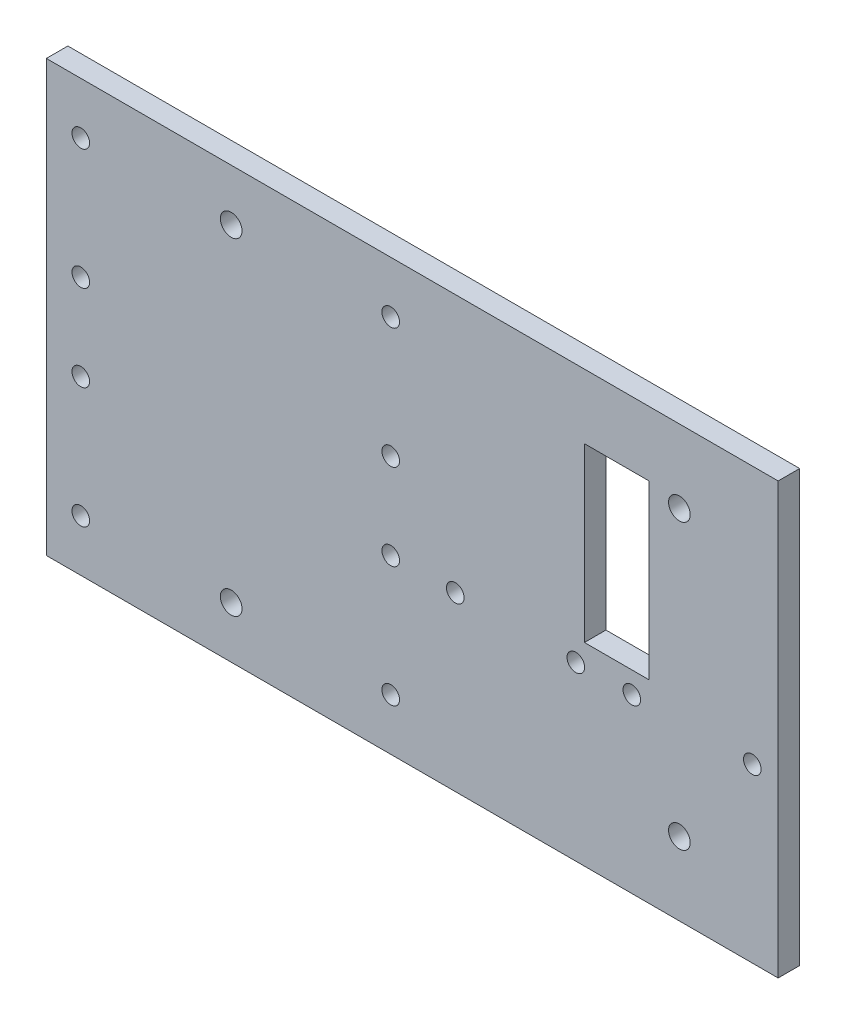
ISO-10303-21;
HEADER;
FILE_DESCRIPTION(('STEP AP214'),'2;1');
FILE_NAME('part.step','',(''),(''),'','','');
FILE_SCHEMA(('AUTOMOTIVE_DESIGN { 1 0 10303 214 1 1 1 1 }'));
ENDSEC;
DATA;
#1=APPLICATION_CONTEXT('core data for automotive mechanical design processes');
#2=APPLICATION_PROTOCOL_DEFINITION('international standard','automotive_design',2000,#1);
#3=PRODUCT_CONTEXT('',#1,'mechanical');
#4=PRODUCT('Part','Part','',(#3));
#5=PRODUCT_RELATED_PRODUCT_CATEGORY('part','',(#4));
#6=PRODUCT_DEFINITION_FORMATION('','',#4);
#7=PRODUCT_DEFINITION_CONTEXT('part definition',#1,'design');
#8=PRODUCT_DEFINITION('design','',#6,#7);
#9=PRODUCT_DEFINITION_SHAPE('','',#8);
#10=(LENGTH_UNIT() NAMED_UNIT(*) SI_UNIT(.MILLI.,.METRE.));
#11=(NAMED_UNIT(*) PLANE_ANGLE_UNIT() SI_UNIT($,.RADIAN.));
#12=(NAMED_UNIT(*) SI_UNIT($,.STERADIAN.) SOLID_ANGLE_UNIT());
#13=UNCERTAINTY_MEASURE_WITH_UNIT(LENGTH_MEASURE(1.E-05),#10,'distance_accuracy_value','');
#14=(GEOMETRIC_REPRESENTATION_CONTEXT(3) GLOBAL_UNCERTAINTY_ASSIGNED_CONTEXT((#13)) GLOBAL_UNIT_ASSIGNED_CONTEXT((#10,
#11,#12)) REPRESENTATION_CONTEXT('',''));
#15=CARTESIAN_POINT('',(0.,0.,0.));
#16=DIRECTION('',(0.,0.,1.));
#17=DIRECTION('',(1.,0.,0.));
#18=AXIS2_PLACEMENT_3D('',#15,#16,#17);
#19=CARTESIAN_POINT('',(47.625,31.75,3.175));
#20=DIRECTION('',(-1.,0.,0.));
#21=DIRECTION('',(0.,0.,1.));
#22=AXIS2_PLACEMENT_3D('',#19,#20,#21);
#23=PLANE('',#22);
#24=DIRECTION('',(0.,1.,0.));
#25=VECTOR('',#24,1.);
#26=CARTESIAN_POINT('',(47.625,31.75,0.));
#27=LINE('',#26,#25);
#28=CARTESIAN_POINT('',(47.625,-31.75,0.));
#29=VERTEX_POINT('',#28);
#30=CARTESIAN_POINT('',(47.625,31.75,0.));
#31=VERTEX_POINT('',#30);
#32=EDGE_CURVE('E111',#29,#31,#27,.T.);
#33=ORIENTED_EDGE('',*,*,#32,.T.);
#34=DIRECTION('',(0.,0.,-1.));
#35=VECTOR('',#34,1.);
#36=CARTESIAN_POINT('',(47.625,31.75,3.175));
#37=LINE('',#36,#35);
#38=CARTESIAN_POINT('',(47.625,31.75,3.175));
#39=VERTEX_POINT('',#38);
#40=EDGE_CURVE('E11',#39,#31,#37,.T.);
#41=ORIENTED_EDGE('',*,*,#40,.F.);
#42=DIRECTION('',(0.,1.,0.));
#43=VECTOR('',#42,1.);
#44=CARTESIAN_POINT('',(47.625,31.75,3.175));
#45=LINE('',#44,#43);
#46=CARTESIAN_POINT('',(47.625,-31.75,3.175));
#47=VERTEX_POINT('',#46);
#48=EDGE_CURVE('E183',#47,#39,#45,.T.);
#49=ORIENTED_EDGE('',*,*,#48,.F.);
#50=DIRECTION('',(0.,0.,-1.));
#51=VECTOR('',#50,1.);
#52=CARTESIAN_POINT('',(47.625,-31.75,3.175));
#53=LINE('',#52,#51);
#54=EDGE_CURVE('E43',#47,#29,#53,.T.);
#55=ORIENTED_EDGE('',*,*,#54,.T.);
#56=EDGE_LOOP('',(#33,#41,#49,#55));
#57=FACE_BOUND('',#56,.T.);
#58=ADVANCED_FACE('F36',(#57),#23,.F.);
#59=CARTESIAN_POINT('',(-47.625,31.75,3.175));
#60=DIRECTION('',(0.,-1.,0.));
#61=DIRECTION('',(0.,0.,-1.));
#62=AXIS2_PLACEMENT_3D('',#59,#60,#61);
#63=PLANE('',#62);
#64=DIRECTION('',(-1.,0.,0.));
#65=VECTOR('',#64,1.);
#66=CARTESIAN_POINT('',(-47.625,31.75,0.));
#67=LINE('',#66,#65);
#68=CARTESIAN_POINT('',(-60.325,31.75,0.));
#69=VERTEX_POINT('',#68);
#70=EDGE_CURVE('E100',#31,#69,#67,.T.);
#71=ORIENTED_EDGE('',*,*,#70,.T.);
#72=DIRECTION('',(0.,0.,1.));
#73=VECTOR('',#72,1.);
#74=CARTESIAN_POINT('',(-60.325,31.75,0.));
#75=LINE('',#74,#73);
#76=CARTESIAN_POINT('',(-60.325,31.75,3.175));
#77=VERTEX_POINT('',#76);
#78=EDGE_CURVE('E103',#69,#77,#75,.T.);
#79=ORIENTED_EDGE('',*,*,#78,.T.);
#80=DIRECTION('',(-1.,0.,0.));
#81=VECTOR('',#80,1.);
#82=CARTESIAN_POINT('',(-47.625,31.75,3.175));
#83=LINE('',#82,#81);
#84=EDGE_CURVE('E186',#39,#77,#83,.T.);
#85=ORIENTED_EDGE('',*,*,#84,.F.);
#86=ORIENTED_EDGE('',*,*,#40,.T.);
#87=EDGE_LOOP('',(#71,#79,#85,#86));
#88=FACE_BOUND('',#87,.T.);
#89=ADVANCED_FACE('F102',(#88),#63,.F.);
#90=CARTESIAN_POINT('',(-47.625,-31.75,3.175));
#91=DIRECTION('',(0.,1.,0.));
#92=DIRECTION('',(0.,0.,1.));
#93=AXIS2_PLACEMENT_3D('',#90,#91,#92);
#94=PLANE('',#93);
#95=DIRECTION('',(1.,0.,0.));
#96=VECTOR('',#95,1.);
#97=CARTESIAN_POINT('',(-47.625,-31.75,0.));
#98=LINE('',#97,#96);
#99=CARTESIAN_POINT('',(-60.325,-31.75,0.));
#100=VERTEX_POINT('',#99);
#101=EDGE_CURVE('E110',#100,#29,#98,.T.);
#102=ORIENTED_EDGE('',*,*,#101,.T.);
#103=ORIENTED_EDGE('',*,*,#54,.F.);
#104=DIRECTION('',(1.,0.,0.));
#105=VECTOR('',#104,1.);
#106=CARTESIAN_POINT('',(-47.625,-31.75,3.175));
#107=LINE('',#106,#105);
#108=CARTESIAN_POINT('',(-60.325,-31.75,3.175));
#109=VERTEX_POINT('',#108);
#110=EDGE_CURVE('E188',#109,#47,#107,.T.);
#111=ORIENTED_EDGE('',*,*,#110,.F.);
#112=DIRECTION('',(0.,0.,1.));
#113=VECTOR('',#112,1.);
#114=CARTESIAN_POINT('',(-60.325,-31.75,0.));
#115=LINE('',#114,#113);
#116=EDGE_CURVE('E120',#100,#109,#115,.T.);
#117=ORIENTED_EDGE('',*,*,#116,.F.);
#118=EDGE_LOOP('',(#102,#103,#111,#117));
#119=FACE_BOUND('',#118,.T.);
#120=ADVANCED_FACE('F196',(#119),#94,.F.);
#121=CARTESIAN_POINT('',(0.,0.,3.175));
#122=DIRECTION('',(0.,0.,1.));
#123=DIRECTION('',(1.,0.,0.));
#124=AXIS2_PLACEMENT_3D('',#121,#122,#123);
#125=PLANE('',#124);
#126=CARTESIAN_POINT('',(0.,-6.35,3.175));
#127=DIRECTION('',(0.,0.,1.));
#128=DIRECTION('',(1.,0.,0.));
#129=AXIS2_PLACEMENT_3D('',#126,#127,#128);
#130=CIRCLE('',#129,1.29999994);
#131=CARTESIAN_POINT('',(1.29999994,-6.35,3.175));
#132=VERTEX_POINT('',#131);
#133=EDGE_CURVE('E492',#132,#132,#130,.T.);
#134=ORIENTED_EDGE('',*,*,#133,.F.);
#135=EDGE_LOOP('',(#134));
#136=FACE_BOUND('',#135,.T.);
#137=CARTESIAN_POINT('',(26.035,-6.34999999999999,3.175));
#138=DIRECTION('',(0.,0.,1.));
#139=DIRECTION('',(1.,0.,0.));
#140=AXIS2_PLACEMENT_3D('',#137,#138,#139);
#141=CIRCLE('',#140,1.29999994);
#142=CARTESIAN_POINT('',(27.33499994,-6.34999999999999,3.175));
#143=VERTEX_POINT('',#142);
#144=EDGE_CURVE('E505',#143,#143,#141,.T.);
#145=ORIENTED_EDGE('',*,*,#144,.F.);
#146=EDGE_LOOP('',(#145));
#147=FACE_BOUND('',#146,.T.);
#148=CARTESIAN_POINT('',(17.78,-6.35,3.175));
#149=DIRECTION('',(0.,0.,1.));
#150=DIRECTION('',(1.,0.,0.));
#151=AXIS2_PLACEMENT_3D('',#148,#149,#150);
#152=CIRCLE('',#151,1.29999994);
#153=CARTESIAN_POINT('',(19.07999994,-6.35,3.175));
#154=VERTEX_POINT('',#153);
#155=EDGE_CURVE('E504',#154,#154,#152,.T.);
#156=ORIENTED_EDGE('',*,*,#155,.F.);
#157=EDGE_LOOP('',(#156));
#158=FACE_BOUND('',#157,.T.);
#159=CARTESIAN_POINT('',(43.815,-6.34999999999999,3.175));
#160=DIRECTION('',(0.,0.,1.));
#161=DIRECTION('',(1.,0.,0.));
#162=AXIS2_PLACEMENT_3D('',#159,#160,#161);
#163=CIRCLE('',#162,1.29999994);
#164=CARTESIAN_POINT('',(45.11499994,-6.34999999999999,3.175));
#165=VERTEX_POINT('',#164);
#166=EDGE_CURVE('E498',#165,#165,#163,.T.);
#167=ORIENTED_EDGE('',*,*,#166,.F.);
#168=EDGE_LOOP('',(#167));
#169=FACE_BOUND('',#168,.T.);
#170=CARTESIAN_POINT('',(-9.525,24.13,3.175));
#171=DIRECTION('',(0.,0.,1.));
#172=DIRECTION('',(1.,0.,0.));
#173=AXIS2_PLACEMENT_3D('',#170,#171,#172);
#174=CIRCLE('',#173,1.3);
#175=CARTESIAN_POINT('',(-8.225,24.13,3.175));
#176=VERTEX_POINT('',#175);
#177=EDGE_CURVE('E536',#176,#176,#174,.T.);
#178=ORIENTED_EDGE('',*,*,#177,.F.);
#179=EDGE_LOOP('',(#178));
#180=FACE_BOUND('',#179,.T.);
#181=CARTESIAN_POINT('',(-9.525,6.35,3.175));
#182=DIRECTION('',(0.,0.,1.));
#183=DIRECTION('',(1.,0.,0.));
#184=AXIS2_PLACEMENT_3D('',#181,#182,#183);
#185=CIRCLE('',#184,1.3);
#186=CARTESIAN_POINT('',(-8.225,6.35,3.175));
#187=VERTEX_POINT('',#186);
#188=EDGE_CURVE('E542',#187,#187,#185,.T.);
#189=ORIENTED_EDGE('',*,*,#188,.F.);
#190=EDGE_LOOP('',(#189));
#191=FACE_BOUND('',#190,.T.);
#192=CARTESIAN_POINT('',(-55.245,6.35,3.175));
#193=DIRECTION('',(0.,0.,1.));
#194=DIRECTION('',(1.,0.,0.));
#195=AXIS2_PLACEMENT_3D('',#192,#193,#194);
#196=CIRCLE('',#195,1.3);
#197=CARTESIAN_POINT('',(-53.945,6.35,3.175));
#198=VERTEX_POINT('',#197);
#199=EDGE_CURVE('E548',#198,#198,#196,.T.);
#200=ORIENTED_EDGE('',*,*,#199,.F.);
#201=EDGE_LOOP('',(#200));
#202=FACE_BOUND('',#201,.T.);
#203=CARTESIAN_POINT('',(-55.245,-6.35,3.175));
#204=DIRECTION('',(0.,0.,1.));
#205=DIRECTION('',(1.,0.,0.));
#206=AXIS2_PLACEMENT_3D('',#203,#204,#205);
#207=CIRCLE('',#206,1.3);
#208=CARTESIAN_POINT('',(-53.945,-6.35,3.175));
#209=VERTEX_POINT('',#208);
#210=EDGE_CURVE('E518',#209,#209,#207,.T.);
#211=ORIENTED_EDGE('',*,*,#210,.F.);
#212=EDGE_LOOP('',(#211));
#213=FACE_BOUND('',#212,.T.);
#214=CARTESIAN_POINT('',(-9.525,-6.35,3.175));
#215=DIRECTION('',(0.,0.,1.));
#216=DIRECTION('',(1.,0.,0.));
#217=AXIS2_PLACEMENT_3D('',#214,#215,#216);
#218=CIRCLE('',#217,1.3);
#219=CARTESIAN_POINT('',(-8.225,-6.35,3.175));
#220=VERTEX_POINT('',#219);
#221=EDGE_CURVE('E519',#220,#220,#218,.T.);
#222=ORIENTED_EDGE('',*,*,#221,.F.);
#223=EDGE_LOOP('',(#222));
#224=FACE_BOUND('',#223,.T.);
#225=CARTESIAN_POINT('',(-9.525,-24.13,3.175));
#226=DIRECTION('',(0.,0.,1.));
#227=DIRECTION('',(1.,0.,0.));
#228=AXIS2_PLACEMENT_3D('',#225,#226,#227);
#229=CIRCLE('',#228,1.3);
#230=CARTESIAN_POINT('',(-8.225,-24.13,3.175));
#231=VERTEX_POINT('',#230);
#232=EDGE_CURVE('E525',#231,#231,#229,.T.);
#233=ORIENTED_EDGE('',*,*,#232,.F.);
#234=EDGE_LOOP('',(#233));
#235=FACE_BOUND('',#234,.T.);
#236=CARTESIAN_POINT('',(-55.245,-24.13,3.175));
#237=DIRECTION('',(0.,0.,1.));
#238=DIRECTION('',(1.,0.,0.));
#239=AXIS2_PLACEMENT_3D('',#236,#237,#238);
#240=CIRCLE('',#239,1.3);
#241=CARTESIAN_POINT('',(-53.945,-24.13,3.175));
#242=VERTEX_POINT('',#241);
#243=EDGE_CURVE('E495',#242,#242,#240,.T.);
#244=ORIENTED_EDGE('',*,*,#243,.F.);
#245=EDGE_LOOP('',(#244));
#246=FACE_BOUND('',#245,.T.);
#247=CARTESIAN_POINT('',(-55.245,24.13,3.175));
#248=DIRECTION('',(0.,0.,1.));
#249=DIRECTION('',(1.,0.,0.));
#250=AXIS2_PLACEMENT_3D('',#247,#248,#249);
#251=CIRCLE('',#250,1.3);
#252=CARTESIAN_POINT('',(-53.945,24.13,3.175));
#253=VERTEX_POINT('',#252);
#254=EDGE_CURVE('E128',#253,#253,#251,.T.);
#255=ORIENTED_EDGE('',*,*,#254,.F.);
#256=EDGE_LOOP('',(#255));
#257=FACE_BOUND('',#256,.T.);
#258=DIRECTION('',(0.,1.,0.));
#259=VECTOR('',#258,1.);
#260=CARTESIAN_POINT('',(28.575,0.,3.175));
#261=LINE('',#260,#259);
#262=CARTESIAN_POINT('',(28.575,-3.175,3.175));
#263=VERTEX_POINT('',#262);
#264=CARTESIAN_POINT('',(28.575,22.225,3.175));
#265=VERTEX_POINT('',#264);
#266=EDGE_CURVE('E157',#263,#265,#261,.T.);
#267=ORIENTED_EDGE('',*,*,#266,.F.);
#268=DIRECTION('',(1.,0.,0.));
#269=VECTOR('',#268,1.);
#270=CARTESIAN_POINT('',(0.,-3.175,3.175));
#271=LINE('',#270,#269);
#272=CARTESIAN_POINT('',(19.05,-3.175,3.175));
#273=VERTEX_POINT('',#272);
#274=EDGE_CURVE('E155',#273,#263,#271,.T.);
#275=ORIENTED_EDGE('',*,*,#274,.F.);
#276=DIRECTION('',(0.,-1.,0.));
#277=VECTOR('',#276,1.);
#278=CARTESIAN_POINT('',(19.05,0.,3.175));
#279=LINE('',#278,#277);
#280=CARTESIAN_POINT('',(19.05,22.225,3.175));
#281=VERTEX_POINT('',#280);
#282=EDGE_CURVE('E153',#281,#273,#279,.T.);
#283=ORIENTED_EDGE('',*,*,#282,.F.);
#284=DIRECTION('',(-1.,0.,0.));
#285=VECTOR('',#284,1.);
#286=CARTESIAN_POINT('',(0.,22.225,3.175));
#287=LINE('',#286,#285);
#288=EDGE_CURVE('E145',#265,#281,#287,.T.);
#289=ORIENTED_EDGE('',*,*,#288,.F.);
#290=EDGE_LOOP('',(#267,#275,#283,#289));
#291=FACE_BOUND('',#290,.T.);
#292=CARTESIAN_POINT('',(33.0581,-20.955,3.175));
#293=DIRECTION('',(0.,0.,1.));
#294=DIRECTION('',(1.,0.,0.));
#295=AXIS2_PLACEMENT_3D('',#292,#293,#294);
#296=CIRCLE('',#295,1.6);
#297=CARTESIAN_POINT('',(34.6581,-20.955,3.175));
#298=VERTEX_POINT('',#297);
#299=EDGE_CURVE('E170',#298,#298,#296,.T.);
#300=ORIENTED_EDGE('',*,*,#299,.F.);
#301=EDGE_LOOP('',(#300));
#302=FACE_BOUND('',#301,.T.);
#303=CARTESIAN_POINT('',(-33.0581,24.13,3.175));
#304=DIRECTION('',(0.,0.,1.));
#305=DIRECTION('',(1.,0.,0.));
#306=AXIS2_PLACEMENT_3D('',#303,#304,#305);
#307=CIRCLE('',#306,1.6);
#308=CARTESIAN_POINT('',(-31.4581,24.13,3.175));
#309=VERTEX_POINT('',#308);
#310=EDGE_CURVE('E163',#309,#309,#307,.T.);
#311=ORIENTED_EDGE('',*,*,#310,.F.);
#312=EDGE_LOOP('',(#311));
#313=FACE_BOUND('',#312,.T.);
#314=CARTESIAN_POINT('',(-33.0581,-24.13,3.175));
#315=DIRECTION('',(0.,0.,1.));
#316=DIRECTION('',(1.,0.,0.));
#317=AXIS2_PLACEMENT_3D('',#314,#315,#316);
#318=CIRCLE('',#317,1.6);
#319=CARTESIAN_POINT('',(-31.4581,-24.13,3.175));
#320=VERTEX_POINT('',#319);
#321=EDGE_CURVE('E159',#320,#320,#318,.T.);
#322=ORIENTED_EDGE('',*,*,#321,.F.);
#323=EDGE_LOOP('',(#322));
#324=FACE_BOUND('',#323,.T.);
#325=CARTESIAN_POINT('',(33.0581,20.955,3.175));
#326=DIRECTION('',(0.,0.,1.));
#327=DIRECTION('',(1.,0.,0.));
#328=AXIS2_PLACEMENT_3D('',#325,#326,#327);
#329=CIRCLE('',#328,1.6);
#330=CARTESIAN_POINT('',(34.6581,20.955,3.175));
#331=VERTEX_POINT('',#330);
#332=EDGE_CURVE('E169',#331,#331,#329,.T.);
#333=ORIENTED_EDGE('',*,*,#332,.F.);
#334=EDGE_LOOP('',(#333));
#335=FACE_BOUND('',#334,.T.);
#336=ORIENTED_EDGE('',*,*,#48,.T.);
#337=ORIENTED_EDGE('',*,*,#84,.T.);
#338=DIRECTION('',(0.,-1.,0.));
#339=VECTOR('',#338,1.);
#340=CARTESIAN_POINT('',(-60.325,31.75,3.175));
#341=LINE('',#340,#339);
#342=EDGE_CURVE('E119',#77,#109,#341,.T.);
#343=ORIENTED_EDGE('',*,*,#342,.T.);
#344=ORIENTED_EDGE('',*,*,#110,.T.);
#345=EDGE_LOOP('',(#336,#337,#343,#344));
#346=FACE_BOUND('',#345,.T.);
#347=ADVANCED_FACE('F198',(#136,#147,#158,#169,#180,#191,#202,#213,#224,#235,#246,#257,#291,
#302,#313,#324,#335,#346),#125,.T.);
#348=CARTESIAN_POINT('',(0.,0.,0.));
#349=DIRECTION('',(0.,0.,1.));
#350=DIRECTION('',(1.,0.,0.));
#351=AXIS2_PLACEMENT_3D('',#348,#349,#350);
#352=PLANE('',#351);
#353=CARTESIAN_POINT('',(0.,-6.35,0.));
#354=DIRECTION('',(0.,0.,1.));
#355=DIRECTION('',(1.,0.,0.));
#356=AXIS2_PLACEMENT_3D('',#353,#354,#355);
#357=CIRCLE('',#356,1.29999994);
#358=CARTESIAN_POINT('',(1.29999994,-6.35,0.));
#359=VERTEX_POINT('',#358);
#360=EDGE_CURVE('E490',#359,#359,#357,.T.);
#361=ORIENTED_EDGE('',*,*,#360,.T.);
#362=EDGE_LOOP('',(#361));
#363=FACE_BOUND('',#362,.T.);
#364=CARTESIAN_POINT('',(26.035,-6.34999999999999,0.));
#365=DIRECTION('',(0.,0.,1.));
#366=DIRECTION('',(1.,0.,0.));
#367=AXIS2_PLACEMENT_3D('',#364,#365,#366);
#368=CIRCLE('',#367,1.29999994);
#369=CARTESIAN_POINT('',(27.33499994,-6.34999999999999,0.));
#370=VERTEX_POINT('',#369);
#371=EDGE_CURVE('E501',#370,#370,#368,.T.);
#372=ORIENTED_EDGE('',*,*,#371,.T.);
#373=EDGE_LOOP('',(#372));
#374=FACE_BOUND('',#373,.T.);
#375=CARTESIAN_POINT('',(17.78,-6.35,0.));
#376=DIRECTION('',(0.,0.,1.));
#377=DIRECTION('',(1.,0.,0.));
#378=AXIS2_PLACEMENT_3D('',#375,#376,#377);
#379=CIRCLE('',#378,1.29999994);
#380=CARTESIAN_POINT('',(19.07999994,-6.35,0.));
#381=VERTEX_POINT('',#380);
#382=EDGE_CURVE('E510',#381,#381,#379,.T.);
#383=ORIENTED_EDGE('',*,*,#382,.T.);
#384=EDGE_LOOP('',(#383));
#385=FACE_BOUND('',#384,.T.);
#386=CARTESIAN_POINT('',(43.815,-6.34999999999999,0.));
#387=DIRECTION('',(0.,0.,1.));
#388=DIRECTION('',(1.,0.,0.));
#389=AXIS2_PLACEMENT_3D('',#386,#387,#388);
#390=CIRCLE('',#389,1.29999994);
#391=CARTESIAN_POINT('',(45.11499994,-6.34999999999999,0.));
#392=VERTEX_POINT('',#391);
#393=EDGE_CURVE('E493',#392,#392,#390,.T.);
#394=ORIENTED_EDGE('',*,*,#393,.T.);
#395=EDGE_LOOP('',(#394));
#396=FACE_BOUND('',#395,.T.);
#397=CARTESIAN_POINT('',(-9.525,24.13,0.));
#398=DIRECTION('',(0.,0.,1.));
#399=DIRECTION('',(1.,0.,0.));
#400=AXIS2_PLACEMENT_3D('',#397,#398,#399);
#401=CIRCLE('',#400,1.3);
#402=CARTESIAN_POINT('',(-8.225,24.13,0.));
#403=VERTEX_POINT('',#402);
#404=EDGE_CURVE('E533',#403,#403,#401,.T.);
#405=ORIENTED_EDGE('',*,*,#404,.T.);
#406=EDGE_LOOP('',(#405));
#407=FACE_BOUND('',#406,.T.);
#408=CARTESIAN_POINT('',(-9.525,6.35,0.));
#409=DIRECTION('',(0.,0.,1.));
#410=DIRECTION('',(1.,0.,0.));
#411=AXIS2_PLACEMENT_3D('',#408,#409,#410);
#412=CIRCLE('',#411,1.3);
#413=CARTESIAN_POINT('',(-8.225,6.35,0.));
#414=VERTEX_POINT('',#413);
#415=EDGE_CURVE('E539',#414,#414,#412,.T.);
#416=ORIENTED_EDGE('',*,*,#415,.T.);
#417=EDGE_LOOP('',(#416));
#418=FACE_BOUND('',#417,.T.);
#419=CARTESIAN_POINT('',(-55.245,6.35,0.));
#420=DIRECTION('',(0.,0.,1.));
#421=DIRECTION('',(1.,0.,0.));
#422=AXIS2_PLACEMENT_3D('',#419,#420,#421);
#423=CIRCLE('',#422,1.3);
#424=CARTESIAN_POINT('',(-53.945,6.35,0.));
#425=VERTEX_POINT('',#424);
#426=EDGE_CURVE('E545',#425,#425,#423,.T.);
#427=ORIENTED_EDGE('',*,*,#426,.T.);
#428=EDGE_LOOP('',(#427));
#429=FACE_BOUND('',#428,.T.);
#430=CARTESIAN_POINT('',(-55.245,-6.35,0.));
#431=DIRECTION('',(0.,0.,1.));
#432=DIRECTION('',(1.,0.,0.));
#433=AXIS2_PLACEMENT_3D('',#430,#431,#432);
#434=CIRCLE('',#433,1.3);
#435=CARTESIAN_POINT('',(-53.945,-6.35,0.));
#436=VERTEX_POINT('',#435);
#437=EDGE_CURVE('E551',#436,#436,#434,.T.);
#438=ORIENTED_EDGE('',*,*,#437,.T.);
#439=EDGE_LOOP('',(#438));
#440=FACE_BOUND('',#439,.T.);
#441=CARTESIAN_POINT('',(-9.525,-6.35,0.));
#442=DIRECTION('',(0.,0.,1.));
#443=DIRECTION('',(1.,0.,0.));
#444=AXIS2_PLACEMENT_3D('',#441,#442,#443);
#445=CIRCLE('',#444,1.3);
#446=CARTESIAN_POINT('',(-8.225,-6.35,0.));
#447=VERTEX_POINT('',#446);
#448=EDGE_CURVE('E515',#447,#447,#445,.T.);
#449=ORIENTED_EDGE('',*,*,#448,.T.);
#450=EDGE_LOOP('',(#449));
#451=FACE_BOUND('',#450,.T.);
#452=CARTESIAN_POINT('',(-9.525,-24.13,0.));
#453=DIRECTION('',(0.,0.,1.));
#454=DIRECTION('',(1.,0.,0.));
#455=AXIS2_PLACEMENT_3D('',#452,#453,#454);
#456=CIRCLE('',#455,1.3);
#457=CARTESIAN_POINT('',(-8.225,-24.13,0.));
#458=VERTEX_POINT('',#457);
#459=EDGE_CURVE('E522',#458,#458,#456,.T.);
#460=ORIENTED_EDGE('',*,*,#459,.T.);
#461=EDGE_LOOP('',(#460));
#462=FACE_BOUND('',#461,.T.);
#463=CARTESIAN_POINT('',(-55.245,-24.13,0.));
#464=DIRECTION('',(0.,0.,1.));
#465=DIRECTION('',(1.,0.,0.));
#466=AXIS2_PLACEMENT_3D('',#463,#464,#465);
#467=CIRCLE('',#466,1.3);
#468=CARTESIAN_POINT('',(-53.945,-24.13,0.));
#469=VERTEX_POINT('',#468);
#470=EDGE_CURVE('E528',#469,#469,#467,.T.);
#471=ORIENTED_EDGE('',*,*,#470,.T.);
#472=EDGE_LOOP('',(#471));
#473=FACE_BOUND('',#472,.T.);
#474=CARTESIAN_POINT('',(-55.245,24.13,0.));
#475=DIRECTION('',(0.,0.,1.));
#476=DIRECTION('',(1.,0.,0.));
#477=AXIS2_PLACEMENT_3D('',#474,#475,#476);
#478=CIRCLE('',#477,1.3);
#479=CARTESIAN_POINT('',(-53.945,24.13,0.));
#480=VERTEX_POINT('',#479);
#481=EDGE_CURVE('E125',#480,#480,#478,.T.);
#482=ORIENTED_EDGE('',*,*,#481,.T.);
#483=EDGE_LOOP('',(#482));
#484=FACE_BOUND('',#483,.T.);
#485=DIRECTION('',(1.,0.,0.));
#486=VECTOR('',#485,1.);
#487=CARTESIAN_POINT('',(19.05,-3.175,0.));
#488=LINE('',#487,#486);
#489=CARTESIAN_POINT('',(19.05,-3.175,0.));
#490=VERTEX_POINT('',#489);
#491=CARTESIAN_POINT('',(28.575,-3.175,0.));
#492=VERTEX_POINT('',#491);
#493=EDGE_CURVE('E139',#490,#492,#488,.T.);
#494=ORIENTED_EDGE('',*,*,#493,.T.);
#495=DIRECTION('',(0.,1.,0.));
#496=VECTOR('',#495,1.);
#497=CARTESIAN_POINT('',(28.575,22.225,0.));
#498=LINE('',#497,#496);
#499=CARTESIAN_POINT('',(28.575,22.225,0.));
#500=VERTEX_POINT('',#499);
#501=EDGE_CURVE('E131',#492,#500,#498,.T.);
#502=ORIENTED_EDGE('',*,*,#501,.T.);
#503=DIRECTION('',(-1.,0.,0.));
#504=VECTOR('',#503,1.);
#505=CARTESIAN_POINT('',(19.05,22.225,0.));
#506=LINE('',#505,#504);
#507=CARTESIAN_POINT('',(19.05,22.225,0.));
#508=VERTEX_POINT('',#507);
#509=EDGE_CURVE('E135',#500,#508,#506,.T.);
#510=ORIENTED_EDGE('',*,*,#509,.T.);
#511=DIRECTION('',(0.,-1.,0.));
#512=VECTOR('',#511,1.);
#513=CARTESIAN_POINT('',(19.05,22.225,0.));
#514=LINE('',#513,#512);
#515=EDGE_CURVE('E58',#508,#490,#514,.T.);
#516=ORIENTED_EDGE('',*,*,#515,.T.);
#517=EDGE_LOOP('',(#494,#502,#510,#516));
#518=FACE_BOUND('',#517,.T.);
#519=CARTESIAN_POINT('',(33.0581,-20.955,0.));
#520=DIRECTION('',(0.,0.,1.));
#521=DIRECTION('',(1.,0.,0.));
#522=AXIS2_PLACEMENT_3D('',#519,#520,#521);
#523=CIRCLE('',#522,1.6);
#524=CARTESIAN_POINT('',(34.6581,-20.955,0.));
#525=VERTEX_POINT('',#524);
#526=EDGE_CURVE('E166',#525,#525,#523,.T.);
#527=ORIENTED_EDGE('',*,*,#526,.T.);
#528=EDGE_LOOP('',(#527));
#529=FACE_BOUND('',#528,.T.);
#530=CARTESIAN_POINT('',(-33.0581,24.13,0.));
#531=DIRECTION('',(0.,0.,1.));
#532=DIRECTION('',(1.,0.,0.));
#533=AXIS2_PLACEMENT_3D('',#530,#531,#532);
#534=CIRCLE('',#533,1.6);
#535=CARTESIAN_POINT('',(-31.4581,24.13,0.));
#536=VERTEX_POINT('',#535);
#537=EDGE_CURVE('E173',#536,#536,#534,.T.);
#538=ORIENTED_EDGE('',*,*,#537,.T.);
#539=EDGE_LOOP('',(#538));
#540=FACE_BOUND('',#539,.T.);
#541=CARTESIAN_POINT('',(-33.0581,-24.13,0.));
#542=DIRECTION('',(0.,0.,1.));
#543=DIRECTION('',(1.,0.,0.));
#544=AXIS2_PLACEMENT_3D('',#541,#542,#543);
#545=CIRCLE('',#544,1.6);
#546=CARTESIAN_POINT('',(-31.4581,-24.13,0.));
#547=VERTEX_POINT('',#546);
#548=EDGE_CURVE('E160',#547,#547,#545,.T.);
#549=ORIENTED_EDGE('',*,*,#548,.T.);
#550=EDGE_LOOP('',(#549));
#551=FACE_BOUND('',#550,.T.);
#552=CARTESIAN_POINT('',(33.0581,20.955,0.));
#553=DIRECTION('',(0.,0.,1.));
#554=DIRECTION('',(1.,0.,0.));
#555=AXIS2_PLACEMENT_3D('',#552,#553,#554);
#556=CIRCLE('',#555,1.6);
#557=CARTESIAN_POINT('',(34.6581,20.955,0.));
#558=VERTEX_POINT('',#557);
#559=EDGE_CURVE('E178',#558,#558,#556,.T.);
#560=ORIENTED_EDGE('',*,*,#559,.T.);
#561=EDGE_LOOP('',(#560));
#562=FACE_BOUND('',#561,.T.);
#563=ORIENTED_EDGE('',*,*,#32,.F.);
#564=ORIENTED_EDGE('',*,*,#101,.F.);
#565=DIRECTION('',(0.,-1.,0.));
#566=VECTOR('',#565,1.);
#567=CARTESIAN_POINT('',(-60.325,31.75,0.));
#568=LINE('',#567,#566);
#569=EDGE_CURVE('E117',#69,#100,#568,.T.);
#570=ORIENTED_EDGE('',*,*,#569,.F.);
#571=ORIENTED_EDGE('',*,*,#70,.F.);
#572=EDGE_LOOP('',(#563,#564,#570,#571));
#573=FACE_BOUND('',#572,.T.);
#574=ADVANCED_FACE('F122',(#363,#374,#385,#396,#407,#418,#429,#440,#451,#462,#473,#484,#518,
#529,#540,#551,#562,#573),#352,.F.);
#575=CARTESIAN_POINT('',(33.0581,20.955,0.));
#576=DIRECTION('',(0.,0.,1.));
#577=DIRECTION('',(1.,0.,0.));
#578=AXIS2_PLACEMENT_3D('',#575,#576,#577);
#579=CYLINDRICAL_SURFACE('',#578,1.6);
#580=ORIENTED_EDGE('',*,*,#559,.F.);
#581=EDGE_LOOP('',(#580));
#582=FACE_BOUND('',#581,.T.);
#583=ORIENTED_EDGE('',*,*,#332,.T.);
#584=EDGE_LOOP('',(#583));
#585=FACE_BOUND('',#584,.T.);
#586=ADVANCED_FACE('F206',(#582,#585),#579,.F.);
#587=CARTESIAN_POINT('',(-33.0581,-24.13,0.));
#588=DIRECTION('',(0.,0.,1.));
#589=DIRECTION('',(1.,0.,0.));
#590=AXIS2_PLACEMENT_3D('',#587,#588,#589);
#591=CYLINDRICAL_SURFACE('',#590,1.6);
#592=ORIENTED_EDGE('',*,*,#548,.F.);
#593=EDGE_LOOP('',(#592));
#594=FACE_BOUND('',#593,.T.);
#595=ORIENTED_EDGE('',*,*,#321,.T.);
#596=EDGE_LOOP('',(#595));
#597=FACE_BOUND('',#596,.T.);
#598=ADVANCED_FACE('F388',(#594,#597),#591,.F.);
#599=CARTESIAN_POINT('',(-33.0581,24.13,0.));
#600=DIRECTION('',(0.,0.,1.));
#601=DIRECTION('',(1.,0.,0.));
#602=AXIS2_PLACEMENT_3D('',#599,#600,#601);
#603=CYLINDRICAL_SURFACE('',#602,1.6);
#604=ORIENTED_EDGE('',*,*,#537,.F.);
#605=EDGE_LOOP('',(#604));
#606=FACE_BOUND('',#605,.T.);
#607=ORIENTED_EDGE('',*,*,#310,.T.);
#608=EDGE_LOOP('',(#607));
#609=FACE_BOUND('',#608,.T.);
#610=ADVANCED_FACE('F391',(#606,#609),#603,.F.);
#611=CARTESIAN_POINT('',(33.0581,-20.955,0.));
#612=DIRECTION('',(0.,0.,1.));
#613=DIRECTION('',(1.,0.,0.));
#614=AXIS2_PLACEMENT_3D('',#611,#612,#613);
#615=CYLINDRICAL_SURFACE('',#614,1.6);
#616=ORIENTED_EDGE('',*,*,#526,.F.);
#617=EDGE_LOOP('',(#616));
#618=FACE_BOUND('',#617,.T.);
#619=ORIENTED_EDGE('',*,*,#299,.T.);
#620=EDGE_LOOP('',(#619));
#621=FACE_BOUND('',#620,.T.);
#622=ADVANCED_FACE('F386',(#618,#621),#615,.F.);
#623=CARTESIAN_POINT('',(28.575,22.225,0.));
#624=DIRECTION('',(1.,0.,0.));
#625=DIRECTION('',(0.,0.,-1.));
#626=AXIS2_PLACEMENT_3D('',#623,#624,#625);
#627=PLANE('',#626);
#628=ORIENTED_EDGE('',*,*,#266,.T.);
#629=DIRECTION('',(0.,0.,1.));
#630=VECTOR('',#629,1.);
#631=CARTESIAN_POINT('',(28.575,22.225,0.));
#632=LINE('',#631,#630);
#633=EDGE_CURVE('E50',#500,#265,#632,.T.);
#634=ORIENTED_EDGE('',*,*,#633,.F.);
#635=ORIENTED_EDGE('',*,*,#501,.F.);
#636=DIRECTION('',(0.,0.,1.));
#637=VECTOR('',#636,1.);
#638=CARTESIAN_POINT('',(28.575,-3.175,0.));
#639=LINE('',#638,#637);
#640=EDGE_CURVE('E142',#492,#263,#639,.T.);
#641=ORIENTED_EDGE('',*,*,#640,.T.);
#642=EDGE_LOOP('',(#628,#634,#635,#641));
#643=FACE_BOUND('',#642,.T.);
#644=ADVANCED_FACE('F379',(#643),#627,.F.);
#645=CARTESIAN_POINT('',(19.05,-3.175,0.));
#646=DIRECTION('',(0.,-1.,0.));
#647=DIRECTION('',(0.,0.,-1.));
#648=AXIS2_PLACEMENT_3D('',#645,#646,#647);
#649=PLANE('',#648);
#650=ORIENTED_EDGE('',*,*,#274,.T.);
#651=ORIENTED_EDGE('',*,*,#640,.F.);
#652=ORIENTED_EDGE('',*,*,#493,.F.);
#653=DIRECTION('',(0.,0.,1.));
#654=VECTOR('',#653,1.);
#655=CARTESIAN_POINT('',(19.05,-3.175,0.));
#656=LINE('',#655,#654);
#657=EDGE_CURVE('E146',#490,#273,#656,.T.);
#658=ORIENTED_EDGE('',*,*,#657,.T.);
#659=EDGE_LOOP('',(#650,#651,#652,#658));
#660=FACE_BOUND('',#659,.T.);
#661=ADVANCED_FACE('F375',(#660),#649,.F.);
#662=CARTESIAN_POINT('',(19.05,22.225,0.));
#663=DIRECTION('',(-1.,0.,0.));
#664=DIRECTION('',(0.,-1.,0.));
#665=AXIS2_PLACEMENT_3D('',#662,#663,#664);
#666=PLANE('',#665);
#667=ORIENTED_EDGE('',*,*,#282,.T.);
#668=ORIENTED_EDGE('',*,*,#657,.F.);
#669=ORIENTED_EDGE('',*,*,#515,.F.);
#670=DIRECTION('',(0.,0.,1.));
#671=VECTOR('',#670,1.);
#672=CARTESIAN_POINT('',(19.05,22.225,0.));
#673=LINE('',#672,#671);
#674=EDGE_CURVE('E149',#508,#281,#673,.T.);
#675=ORIENTED_EDGE('',*,*,#674,.T.);
#676=EDGE_LOOP('',(#667,#668,#669,#675));
#677=FACE_BOUND('',#676,.T.);
#678=ADVANCED_FACE('F378',(#677),#666,.F.);
#679=CARTESIAN_POINT('',(19.05,22.225,0.));
#680=DIRECTION('',(0.,1.,0.));
#681=DIRECTION('',(0.,0.,1.));
#682=AXIS2_PLACEMENT_3D('',#679,#680,#681);
#683=PLANE('',#682);
#684=ORIENTED_EDGE('',*,*,#288,.T.);
#685=ORIENTED_EDGE('',*,*,#674,.F.);
#686=ORIENTED_EDGE('',*,*,#509,.F.);
#687=ORIENTED_EDGE('',*,*,#633,.T.);
#688=EDGE_LOOP('',(#684,#685,#686,#687));
#689=FACE_BOUND('',#688,.T.);
#690=ADVANCED_FACE('F236',(#689),#683,.F.);
#691=CARTESIAN_POINT('',(-60.325,31.75,0.));
#692=DIRECTION('',(-1.,0.,0.));
#693=DIRECTION('',(0.,0.,1.));
#694=AXIS2_PLACEMENT_3D('',#691,#692,#693);
#695=PLANE('',#694);
#696=ORIENTED_EDGE('',*,*,#342,.F.);
#697=ORIENTED_EDGE('',*,*,#78,.F.);
#698=ORIENTED_EDGE('',*,*,#569,.T.);
#699=ORIENTED_EDGE('',*,*,#116,.T.);
#700=EDGE_LOOP('',(#696,#697,#698,#699));
#701=FACE_BOUND('',#700,.T.);
#702=ADVANCED_FACE('F115',(#701),#695,.T.);
#703=CARTESIAN_POINT('',(-55.245,24.13,0.));
#704=DIRECTION('',(0.,0.,1.));
#705=DIRECTION('',(1.,0.,0.));
#706=AXIS2_PLACEMENT_3D('',#703,#704,#705);
#707=CYLINDRICAL_SURFACE('',#706,1.3);
#708=ORIENTED_EDGE('',*,*,#481,.F.);
#709=EDGE_LOOP('',(#708));
#710=FACE_BOUND('',#709,.T.);
#711=ORIENTED_EDGE('',*,*,#254,.T.);
#712=EDGE_LOOP('',(#711));
#713=FACE_BOUND('',#712,.T.);
#714=ADVANCED_FACE('F235',(#710,#713),#707,.F.);
#715=CARTESIAN_POINT('',(-55.245,-24.13,0.));
#716=DIRECTION('',(0.,0.,1.));
#717=DIRECTION('',(1.,0.,0.));
#718=AXIS2_PLACEMENT_3D('',#715,#716,#717);
#719=CYLINDRICAL_SURFACE('',#718,1.3);
#720=ORIENTED_EDGE('',*,*,#470,.F.);
#721=EDGE_LOOP('',(#720));
#722=FACE_BOUND('',#721,.T.);
#723=ORIENTED_EDGE('',*,*,#243,.T.);
#724=EDGE_LOOP('',(#723));
#725=FACE_BOUND('',#724,.T.);
#726=ADVANCED_FACE('F247',(#722,#725),#719,.F.);
#727=CARTESIAN_POINT('',(-9.525,-24.13,0.));
#728=DIRECTION('',(0.,0.,1.));
#729=DIRECTION('',(1.,0.,0.));
#730=AXIS2_PLACEMENT_3D('',#727,#728,#729);
#731=CYLINDRICAL_SURFACE('',#730,1.3);
#732=ORIENTED_EDGE('',*,*,#459,.F.);
#733=EDGE_LOOP('',(#732));
#734=FACE_BOUND('',#733,.T.);
#735=ORIENTED_EDGE('',*,*,#232,.T.);
#736=EDGE_LOOP('',(#735));
#737=FACE_BOUND('',#736,.T.);
#738=ADVANCED_FACE('F257',(#734,#737),#731,.F.);
#739=CARTESIAN_POINT('',(-9.525,-6.35,0.));
#740=DIRECTION('',(0.,0.,1.));
#741=DIRECTION('',(1.,0.,0.));
#742=AXIS2_PLACEMENT_3D('',#739,#740,#741);
#743=CYLINDRICAL_SURFACE('',#742,1.3);
#744=ORIENTED_EDGE('',*,*,#448,.F.);
#745=EDGE_LOOP('',(#744));
#746=FACE_BOUND('',#745,.T.);
#747=ORIENTED_EDGE('',*,*,#221,.T.);
#748=EDGE_LOOP('',(#747));
#749=FACE_BOUND('',#748,.T.);
#750=ADVANCED_FACE('F267',(#746,#749),#743,.F.);
#751=CARTESIAN_POINT('',(-55.245,-6.35,0.));
#752=DIRECTION('',(0.,0.,1.));
#753=DIRECTION('',(1.,0.,0.));
#754=AXIS2_PLACEMENT_3D('',#751,#752,#753);
#755=CYLINDRICAL_SURFACE('',#754,1.3);
#756=ORIENTED_EDGE('',*,*,#437,.F.);
#757=EDGE_LOOP('',(#756));
#758=FACE_BOUND('',#757,.T.);
#759=ORIENTED_EDGE('',*,*,#210,.T.);
#760=EDGE_LOOP('',(#759));
#761=FACE_BOUND('',#760,.T.);
#762=ADVANCED_FACE('F277',(#758,#761),#755,.F.);
#763=CARTESIAN_POINT('',(-55.245,6.35,0.));
#764=DIRECTION('',(0.,0.,1.));
#765=DIRECTION('',(1.,0.,0.));
#766=AXIS2_PLACEMENT_3D('',#763,#764,#765);
#767=CYLINDRICAL_SURFACE('',#766,1.3);
#768=ORIENTED_EDGE('',*,*,#426,.F.);
#769=EDGE_LOOP('',(#768));
#770=FACE_BOUND('',#769,.T.);
#771=ORIENTED_EDGE('',*,*,#199,.T.);
#772=EDGE_LOOP('',(#771));
#773=FACE_BOUND('',#772,.T.);
#774=ADVANCED_FACE('F287',(#770,#773),#767,.F.);
#775=CARTESIAN_POINT('',(-9.525,6.35,0.));
#776=DIRECTION('',(0.,0.,1.));
#777=DIRECTION('',(1.,0.,0.));
#778=AXIS2_PLACEMENT_3D('',#775,#776,#777);
#779=CYLINDRICAL_SURFACE('',#778,1.3);
#780=ORIENTED_EDGE('',*,*,#415,.F.);
#781=EDGE_LOOP('',(#780));
#782=FACE_BOUND('',#781,.T.);
#783=ORIENTED_EDGE('',*,*,#188,.T.);
#784=EDGE_LOOP('',(#783));
#785=FACE_BOUND('',#784,.T.);
#786=ADVANCED_FACE('F297',(#782,#785),#779,.F.);
#787=CARTESIAN_POINT('',(-9.525,24.13,0.));
#788=DIRECTION('',(0.,0.,1.));
#789=DIRECTION('',(1.,0.,0.));
#790=AXIS2_PLACEMENT_3D('',#787,#788,#789);
#791=CYLINDRICAL_SURFACE('',#790,1.3);
#792=ORIENTED_EDGE('',*,*,#404,.F.);
#793=EDGE_LOOP('',(#792));
#794=FACE_BOUND('',#793,.T.);
#795=ORIENTED_EDGE('',*,*,#177,.T.);
#796=EDGE_LOOP('',(#795));
#797=FACE_BOUND('',#796,.T.);
#798=ADVANCED_FACE('F307',(#794,#797),#791,.F.);
#799=CARTESIAN_POINT('',(43.815,-6.34999999999999,0.));
#800=DIRECTION('',(0.,0.,1.));
#801=DIRECTION('',(1.,0.,0.));
#802=AXIS2_PLACEMENT_3D('',#799,#800,#801);
#803=CYLINDRICAL_SURFACE('',#802,1.29999994);
#804=ORIENTED_EDGE('',*,*,#393,.F.);
#805=EDGE_LOOP('',(#804));
#806=FACE_BOUND('',#805,.T.);
#807=ORIENTED_EDGE('',*,*,#166,.T.);
#808=EDGE_LOOP('',(#807));
#809=FACE_BOUND('',#808,.T.);
#810=ADVANCED_FACE('F316',(#806,#809),#803,.F.);
#811=CARTESIAN_POINT('',(17.78,-6.35,0.));
#812=DIRECTION('',(0.,0.,1.));
#813=DIRECTION('',(1.,0.,0.));
#814=AXIS2_PLACEMENT_3D('',#811,#812,#813);
#815=CYLINDRICAL_SURFACE('',#814,1.29999994);
#816=ORIENTED_EDGE('',*,*,#382,.F.);
#817=EDGE_LOOP('',(#816));
#818=FACE_BOUND('',#817,.T.);
#819=ORIENTED_EDGE('',*,*,#155,.T.);
#820=EDGE_LOOP('',(#819));
#821=FACE_BOUND('',#820,.T.);
#822=ADVANCED_FACE('F338',(#818,#821),#815,.F.);
#823=CARTESIAN_POINT('',(26.035,-6.34999999999999,0.));
#824=DIRECTION('',(0.,0.,1.));
#825=DIRECTION('',(1.,0.,0.));
#826=AXIS2_PLACEMENT_3D('',#823,#824,#825);
#827=CYLINDRICAL_SURFACE('',#826,1.29999994);
#828=ORIENTED_EDGE('',*,*,#371,.F.);
#829=EDGE_LOOP('',(#828));
#830=FACE_BOUND('',#829,.T.);
#831=ORIENTED_EDGE('',*,*,#144,.T.);
#832=EDGE_LOOP('',(#831));
#833=FACE_BOUND('',#832,.T.);
#834=ADVANCED_FACE('F348',(#830,#833),#827,.F.);
#835=CARTESIAN_POINT('',(0.,-6.35,0.));
#836=DIRECTION('',(0.,0.,1.));
#837=DIRECTION('',(1.,0.,0.));
#838=AXIS2_PLACEMENT_3D('',#835,#836,#837);
#839=CYLINDRICAL_SURFACE('',#838,1.29999994);
#840=ORIENTED_EDGE('',*,*,#360,.F.);
#841=EDGE_LOOP('',(#840));
#842=FACE_BOUND('',#841,.T.);
#843=ORIENTED_EDGE('',*,*,#133,.T.);
#844=EDGE_LOOP('',(#843));
#845=FACE_BOUND('',#844,.T.);
#846=ADVANCED_FACE('F358',(#842,#845),#839,.F.);
#847=CLOSED_SHELL('',(#58,#89,#120,#347,#574,#586,#598,#610,#622,#644,#661,#678,#690,#702,#714,
#726,#738,#750,#762,#774,#786,#798,#810,#822,#834,#846));
#848=MANIFOLD_SOLID_BREP('B2',#847);
#849=ADVANCED_BREP_SHAPE_REPRESENTATION('',(#18,#848),#14);
#850=SHAPE_DEFINITION_REPRESENTATION(#9,#849);
ENDSEC;
END-ISO-10303-21;
